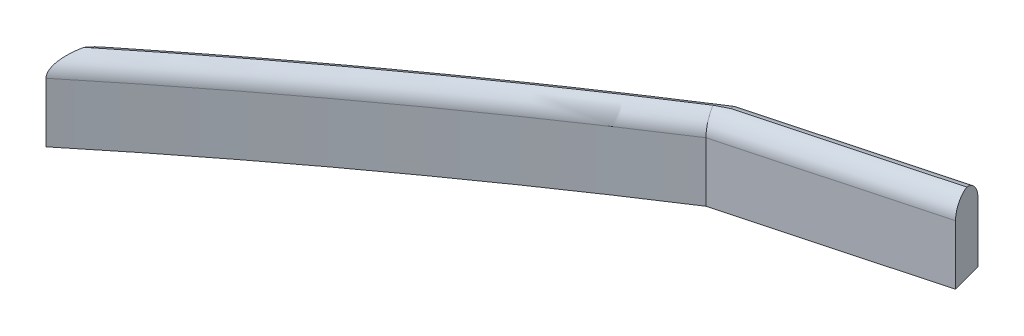
ISO-10303-21;
HEADER;
FILE_DESCRIPTION(('STEP AP214'),'2;1');
FILE_NAME('part.step','',(''),(''),'','','');
FILE_SCHEMA(('AUTOMOTIVE_DESIGN { 1 0 10303 214 1 1 1 1 }'));
ENDSEC;
DATA;
#1=APPLICATION_CONTEXT('core data for automotive mechanical design processes');
#2=APPLICATION_PROTOCOL_DEFINITION('international standard','automotive_design',2000,#1);
#3=PRODUCT_CONTEXT('',#1,'mechanical');
#4=PRODUCT('Part','Part','',(#3));
#5=PRODUCT_RELATED_PRODUCT_CATEGORY('part','',(#4));
#6=PRODUCT_DEFINITION_FORMATION('','',#4);
#7=PRODUCT_DEFINITION_CONTEXT('part definition',#1,'design');
#8=PRODUCT_DEFINITION('design','',#6,#7);
#9=PRODUCT_DEFINITION_SHAPE('','',#8);
#10=(LENGTH_UNIT() NAMED_UNIT(*) SI_UNIT(.MILLI.,.METRE.));
#11=(NAMED_UNIT(*) PLANE_ANGLE_UNIT() SI_UNIT($,.RADIAN.));
#12=(NAMED_UNIT(*) SI_UNIT($,.STERADIAN.) SOLID_ANGLE_UNIT());
#13=UNCERTAINTY_MEASURE_WITH_UNIT(LENGTH_MEASURE(1.E-05),#10,'distance_accuracy_value','');
#14=(GEOMETRIC_REPRESENTATION_CONTEXT(3) GLOBAL_UNCERTAINTY_ASSIGNED_CONTEXT((#13)) GLOBAL_UNIT_ASSIGNED_CONTEXT((#10,
#11,#12)) REPRESENTATION_CONTEXT('',''));
#15=CARTESIAN_POINT('',(0.,0.,0.));
#16=DIRECTION('',(0.,0.,1.));
#17=DIRECTION('',(1.,0.,0.));
#18=AXIS2_PLACEMENT_3D('',#15,#16,#17);
#19=CARTESIAN_POINT('',(-1.4296369539497,4.,-5.31676859567869));
#20=DIRECTION('',(-0.259668492412526,0.,-0.965697817149964));
#21=DIRECTION('',(-0.965697817149964,0.,0.259668492412526));
#22=AXIS2_PLACEMENT_3D('',#19,#20,#21);
#23=PLANE('',#22);
#24=DIRECTION('',(0.,-1.,0.));
#25=VECTOR('',#24,1.);
#26=CARTESIAN_POINT('',(13.350341006576,4.,-9.29098757675367));
#27=LINE('',#26,#25);
#28=CARTESIAN_POINT('',(13.350341006576,3.,-9.29098757675367));
#29=VERTEX_POINT('',#28);
#30=CARTESIAN_POINT('',(13.350341006576,0.,-9.29098757675367));
#31=VERTEX_POINT('',#30);
#32=EDGE_CURVE('E84',#29,#31,#27,.T.);
#33=ORIENTED_EDGE('',*,*,#32,.F.);
#34=DIRECTION('',(0.965697817149964,0.,-0.259668492412526));
#35=VECTOR('',#34,1.);
#36=CARTESIAN_POINT('',(-1.4296369539497,3.,-5.31676859567869));
#37=LINE('',#36,#35);
#38=CARTESIAN_POINT('',(22.8710214235548,3.,-11.85102311449));
#39=VERTEX_POINT('',#38);
#40=EDGE_CURVE('E127',#29,#39,#37,.T.);
#41=ORIENTED_EDGE('',*,*,#40,.T.);
#42=DIRECTION('',(0.,-1.,0.));
#43=VECTOR('',#42,1.);
#44=CARTESIAN_POINT('',(22.8710214235548,4.,-11.85102311449));
#45=LINE('',#44,#43);
#46=CARTESIAN_POINT('',(22.8710214235548,0.,-11.85102311449));
#47=VERTEX_POINT('',#46);
#48=EDGE_CURVE('E210',#39,#47,#45,.T.);
#49=ORIENTED_EDGE('',*,*,#48,.T.);
#50=DIRECTION('',(0.965697817149964,0.,-0.259668492412526));
#51=VECTOR('',#50,1.);
#52=CARTESIAN_POINT('',(-1.4296369539497,0.,-5.31676859567869));
#53=LINE('',#52,#51);
#54=EDGE_CURVE('E222',#31,#47,#53,.T.);
#55=ORIENTED_EDGE('',*,*,#54,.F.);
#56=EDGE_LOOP('',(#33,#41,#49,#55));
#57=FACE_BOUND('',#56,.T.);
#58=ADVANCED_FACE('F41',(#57),#23,.T.);
#59=CARTESIAN_POINT('',(127.771889532109,4.,169.359958318483));
#60=DIRECTION('',(0.,-1.,0.));
#61=DIRECTION('',(0.,0.,-1.));
#62=AXIS2_PLACEMENT_3D('',#59,#60,#61);
#63=CYLINDRICAL_SURFACE('',#62,212.151953175651);
#64=DIRECTION('',(0.,-1.,0.));
#65=VECTOR('',#64,1.);
#66=CARTESIAN_POINT('',(-4.82016025459314,4.,3.74655436335475));
#67=LINE('',#66,#65);
#68=CARTESIAN_POINT('',(-4.82016025459314,3.,3.74655436335475));
#69=VERTEX_POINT('',#68);
#70=CARTESIAN_POINT('',(-4.82016025459314,0.,3.74655436335475));
#71=VERTEX_POINT('',#70);
#72=EDGE_CURVE('E133',#69,#71,#67,.T.);
#73=ORIENTED_EDGE('',*,*,#72,.F.);
#74=CARTESIAN_POINT('',(127.771889532109,3.,169.359958318483));
#75=DIRECTION('',(0.,1.,0.));
#76=DIRECTION('',(0.,0.,1.));
#77=AXIS2_PLACEMENT_3D('',#74,#75,#76);
#78=CIRCLE('',#77,212.151953175651);
#79=EDGE_CURVE('E11',#69,#29,#78,.F.);
#80=ORIENTED_EDGE('',*,*,#79,.T.);
#81=ORIENTED_EDGE('',*,*,#32,.T.);
#82=CARTESIAN_POINT('',(127.771889532109,0.,169.359958318483));
#83=DIRECTION('',(0.,1.,0.));
#84=DIRECTION('',(0.,0.,1.));
#85=AXIS2_PLACEMENT_3D('',#82,#83,#84);
#86=CIRCLE('',#85,212.151953175651);
#87=EDGE_CURVE('E192',#31,#71,#86,.T.);
#88=ORIENTED_EDGE('',*,*,#87,.T.);
#89=EDGE_LOOP('',(#73,#80,#81,#88));
#90=FACE_BOUND('',#89,.T.);
#91=ADVANCED_FACE('F184',(#90),#63,.T.);
#92=CARTESIAN_POINT('',(-2.81187917765675,4.,-1.15264600679133));
#93=DIRECTION('',(-0.925277827563089,0.,-0.379290049724655));
#94=DIRECTION('',(-0.379290049724655,0.,0.925277827563089));
#95=AXIS2_PLACEMENT_3D('',#92,#93,#94);
#96=PLANE('',#95);
#97=DIRECTION('',(0.,-1.,0.));
#98=VECTOR('',#97,1.);
#99=CARTESIAN_POINT('',(-5.92806895412716,4.,6.44929690929623));
#100=LINE('',#99,#98);
#101=CARTESIAN_POINT('',(-5.92806895412716,3.,6.44929690929623));
#102=VERTEX_POINT('',#101);
#103=CARTESIAN_POINT('',(-5.92806895412716,0.,6.44929690929623));
#104=VERTEX_POINT('',#103);
#105=EDGE_CURVE('E121',#102,#104,#100,.T.);
#106=ORIENTED_EDGE('',*,*,#105,.F.);
#107=CARTESIAN_POINT('',(-5.92806895412707,3.,6.44929690929634));
#108=CARTESIAN_POINT('',(-5.92809716579559,3.02899945754281,6.44936573164299));
#109=CARTESIAN_POINT('',(-5.92706230414477,3.05790291660423,6.44684118732441));
#110=CARTESIAN_POINT('',(-5.92312672924477,3.1144987618452,6.43724035493674));
#111=CARTESIAN_POINT('',(-5.92024663940333,3.14220096452951,6.43021437765736));
#112=CARTESIAN_POINT('',(-5.91199159838725,3.20246188056569,6.41007621051235));
#113=CARTESIAN_POINT('',(-5.90618552708595,3.23460369165767,6.39591230338046));
#114=CARTESIAN_POINT('',(-5.89267654183276,3.2960853343428,6.36295714271455));
#115=CARTESIAN_POINT('',(-5.88496504082401,3.32541162285829,6.34414494106095));
#116=CARTESIAN_POINT('',(-5.86337083256309,3.39705779459704,6.29146588417003));
#117=CARTESIAN_POINT('',(-5.84847803765235,3.43724007259731,6.25513492075204));
#118=CARTESIAN_POINT('',(-5.81663463457315,3.5113554732729,6.17745295982339));
#119=CARTESIAN_POINT('',(-5.79968003428045,3.54527614189422,6.13609222352826));
#120=CARTESIAN_POINT('',(-5.76542979328686,3.60618066333855,6.05253878308585));
#121=CARTESIAN_POINT('',(-5.7482044188758,3.63344375213111,6.01051749350656));
#122=CARTESIAN_POINT('',(-5.71293618098463,3.68405212816676,5.92448065030012));
#123=CARTESIAN_POINT('',(-5.6948926040173,3.7073939091583,5.88046335612139));
#124=CARTESIAN_POINT('',(-5.65814644543494,3.75078544429752,5.79082112635803));
#125=CARTESIAN_POINT('',(-5.63944112272148,3.77081890521704,5.74518950386557));
#126=CARTESIAN_POINT('',(-5.60160375579942,3.80787461838802,5.65288527207313));
#127=CARTESIAN_POINT('',(-5.58247156635815,3.82489582763236,5.60621230847814));
#128=CARTESIAN_POINT('',(-5.52822346391773,3.86897455481798,5.47387409815089));
#129=CARTESIAN_POINT('',(-5.4927455839235,3.89295624675614,5.38732583317154));
#130=CARTESIAN_POINT('',(-5.4211515759688,3.93333004862564,5.21267229771772));
#131=CARTESIAN_POINT('',(-5.38503476726694,3.94971348561067,5.12456536657511));
#132=CARTESIAN_POINT('',(-5.31334084607263,3.97524582561528,4.9496680928388));
#133=CARTESIAN_POINT('',(-5.277772331654,3.9845628778426,4.86289872524056));
#134=CARTESIAN_POINT('',(-5.22435320822047,3.99384234550716,4.73258280865699));
#135=CARTESIAN_POINT('',(-5.20655636837845,3.99615284719928,4.68916742953362));
#136=CARTESIAN_POINT('',(-5.17094480785062,3.99923054595483,4.60229305098022));
#137=CARTESIAN_POINT('',(-5.15313008860525,3.99999785869761,4.5588340550641));
#138=CARTESIAN_POINT('',(-5.13531396659629,4.,4.51537163710715));
#139=B_SPLINE_CURVE_WITH_KNOTS('',3,(#107,#108,#109,#110,#111,#112,#113,#114,#115,#116,#117,
#118,#119,#120,#121,#122,#123,#124,#125,#126,#127,#128,#129,#130,#131,#132,#133,#134,#135,#136,
#137,#138),.UNSPECIFIED.,.F.,.F.,(4,2,2,2,2,2,2,2,2,2,2,2,2,2,2,4),(0.,0.0867150780349251,
0.172477492175808,0.278688252277466,0.385386685230202,0.552985841834986,0.720914835918608,
0.87959089474906,1.03840808778212,1.19798551207075,1.35761808318556,1.64689475289305,
1.93650080656908,2.2189783041187,2.35989191975161,2.50079497193032),.UNSPECIFIED.);
#140=CARTESIAN_POINT('',(-5.37104694113991,3.95424577492995,5.0904420739115));
#141=VERTEX_POINT('',#140);
#142=EDGE_CURVE('E52',#102,#141,#139,.T.);
#143=ORIENTED_EDGE('',*,*,#142,.T.);
#144=CARTESIAN_POINT('',(-5.6078961446883,4.,5.66823555064097));
#145=CARTESIAN_POINT('',(-5.58711246686556,3.99999611395211,5.61753378222243));
#146=CARTESIAN_POINT('',(-5.5663302621837,3.99897254997292,5.5668356075301));
#147=CARTESIAN_POINT('',(-5.52479181596345,3.9948461518032,5.46550259521692));
#148=CARTESIAN_POINT('',(-5.50403557994838,3.99174293243523,5.4148677710702));
#149=CARTESIAN_POINT('',(-5.44162496278576,3.97920887466118,5.26261711143115));
#150=CARTESIAN_POINT('',(-5.40005687796771,3.96655268177009,5.16121179577808));
#151=CARTESIAN_POINT('',(-5.31705502323599,3.93174172427004,4.95872882559305));
#152=CARTESIAN_POINT('',(-5.27562663175522,3.90949440962198,4.85766429174464));
#153=CARTESIAN_POINT('',(-5.21434419819725,3.86787919043,4.70816583526929));
#154=CARTESIAN_POINT('',(-5.19408126030891,3.85265405130243,4.65873441157922));
#155=CARTESIAN_POINT('',(-5.15392378125981,3.81915503654631,4.5607702677744));
#156=CARTESIAN_POINT('',(-5.13402913080737,3.80088208202814,4.51223728104269));
#157=CARTESIAN_POINT('',(-5.09326479659602,3.75940554777733,4.41279271446753));
#158=CARTESIAN_POINT('',(-5.07243371105388,3.73593515486883,4.36197529494861));
#159=CARTESIAN_POINT('',(-5.03159264651004,3.68437046994959,4.26234354477766));
#160=CARTESIAN_POINT('',(-5.01158282981133,3.65627526940739,4.2135296100637));
#161=CARTESIAN_POINT('',(-4.97263739180054,3.59432972619622,4.118522239577));
#162=CARTESIAN_POINT('',(-4.95371232435814,3.56043257868085,4.07235454996241));
#163=CARTESIAN_POINT('',(-4.91787205020168,3.48589854982672,3.98492222466194));
#164=CARTESIAN_POINT('',(-4.90095135679391,3.44528083263623,3.94364420419036));
#165=CARTESIAN_POINT('',(-4.87694660633733,3.37513247061037,3.88508463119395));
#166=CARTESIAN_POINT('',(-4.86874698388639,3.34827110679535,3.86508165760224));
#167=CARTESIAN_POINT('',(-4.85381853130618,3.29177287607716,3.82866370732297));
#168=CARTESIAN_POINT('',(-4.84709016915666,3.26213513032949,3.8122498722717));
#169=CARTESIAN_POINT('',(-4.83551492984212,3.19984027132433,3.78401208355498));
#170=CARTESIAN_POINT('',(-4.83069530244911,3.16714713082261,3.77225460569047));
#171=CARTESIAN_POINT('',(-4.82362787784757,3.09993513224536,3.75501362800985));
#172=CARTESIAN_POINT('',(-4.82136952580864,3.06542438475816,3.74950437969193));
#173=CARTESIAN_POINT('',(-4.82028164679566,3.02049847519439,3.7468504995532));
#174=CARTESIAN_POINT('',(-4.82015727361924,3.01024681837726,3.74654709127088));
#175=CARTESIAN_POINT('',(-4.82016025459324,2.99999999999999,3.746554363355));
#176=B_SPLINE_CURVE_WITH_KNOTS('',3,(#144,#145,#146,#147,#148,#149,#150,#151,#152,#153,#154,
#155,#156,#157,#158,#159,#160,#161,#162,#163,#164,#165,#166,#167,#168,#169,#170,#171,#172,#173,
#174,#175),.UNSPECIFIED.,.F.,.F.,(4,2,2,2,2,2,2,2,2,2,2,2,2,2,2,4),(0.,0.164370782835836,
0.328772017554944,0.659374601256373,0.993241378589786,1.15981937531923,1.32634711978404,
1.50534937203079,1.68438683086293,1.86494325923908,2.04499342247238,2.14817992071673,
2.25139919302061,2.35604308751101,2.46025416709694,2.49100412049127),.UNSPECIFIED.);
#177=EDGE_CURVE('E126',#141,#69,#176,.T.);
#178=ORIENTED_EDGE('',*,*,#177,.T.);
#179=ORIENTED_EDGE('',*,*,#72,.T.);
#180=DIRECTION('',(0.379290049724655,0.,-0.925277827563089));
#181=VECTOR('',#180,1.);
#182=CARTESIAN_POINT('',(-2.81187917765675,0.,-1.15264600679133));
#183=LINE('',#182,#181);
#184=EDGE_CURVE('E131',#104,#71,#183,.T.);
#185=ORIENTED_EDGE('',*,*,#184,.F.);
#186=EDGE_LOOP('',(#106,#143,#178,#179,#185));
#187=FACE_BOUND('',#186,.T.);
#188=ADVANCED_FACE('F129',(#187),#96,.T.);
#189=CARTESIAN_POINT('',(127.771889532109,4.,169.359958318483));
#190=DIRECTION('',(0.,-1.,0.));
#191=DIRECTION('',(0.,0.,-1.));
#192=AXIS2_PLACEMENT_3D('',#189,#190,#191);
#193=CYLINDRICAL_SURFACE('',#192,210.75);
#194=DIRECTION('',(0.,-1.,0.));
#195=VECTOR('',#194,1.);
#196=CARTESIAN_POINT('',(13.350341006576,4.,-7.62385939663734));
#197=LINE('',#196,#195);
#198=CARTESIAN_POINT('',(13.350341006576,3.,-7.62385939663734));
#199=VERTEX_POINT('',#198);
#200=CARTESIAN_POINT('',(13.350341006576,0.,-7.62385939663734));
#201=VERTEX_POINT('',#200);
#202=EDGE_CURVE('E123',#199,#201,#197,.T.);
#203=ORIENTED_EDGE('',*,*,#202,.F.);
#204=CARTESIAN_POINT('',(127.771889532109,3.,169.359958318483));
#205=DIRECTION('',(0.,1.,0.));
#206=DIRECTION('',(0.,0.,1.));
#207=AXIS2_PLACEMENT_3D('',#204,#205,#206);
#208=CIRCLE('',#207,210.75);
#209=EDGE_CURVE('E118',#199,#102,#208,.T.);
#210=ORIENTED_EDGE('',*,*,#209,.T.);
#211=ORIENTED_EDGE('',*,*,#105,.T.);
#212=CARTESIAN_POINT('',(127.771889532109,0.,169.359958318483));
#213=DIRECTION('',(0.,1.,0.));
#214=DIRECTION('',(0.,0.,1.));
#215=AXIS2_PLACEMENT_3D('',#212,#213,#214);
#216=CIRCLE('',#215,210.75);
#217=EDGE_CURVE('E218',#201,#104,#216,.T.);
#218=ORIENTED_EDGE('',*,*,#217,.F.);
#219=EDGE_LOOP('',(#203,#210,#211,#218));
#220=FACE_BOUND('',#219,.T.);
#221=ADVANCED_FACE('F119',(#220),#193,.F.);
#222=CARTESIAN_POINT('',(-1.01158573039647,4.,-3.76205107761778));
#223=DIRECTION('',(0.259668492412525,0.,0.965697817149965));
#224=DIRECTION('',(0.965697817149965,0.,-0.259668492412525));
#225=AXIS2_PLACEMENT_3D('',#222,#223,#224);
#226=PLANE('',#225);
#227=DIRECTION('',(0.,-1.,0.));
#228=VECTOR('',#227,1.);
#229=CARTESIAN_POINT('',(23.2890726471078,4.,-10.296305596429));
#230=LINE('',#229,#228);
#231=CARTESIAN_POINT('',(23.2890726471078,3.,-10.296305596429));
#232=VERTEX_POINT('',#231);
#233=CARTESIAN_POINT('',(23.2890726471078,0.,-10.296305596429));
#234=VERTEX_POINT('',#233);
#235=EDGE_CURVE('E208',#232,#234,#230,.T.);
#236=ORIENTED_EDGE('',*,*,#235,.F.);
#237=DIRECTION('',(-0.965697817149965,0.,0.259668492412525));
#238=VECTOR('',#237,1.);
#239=CARTESIAN_POINT('',(-1.01158573039647,3.,-3.76205107761778));
#240=LINE('',#239,#238);
#241=EDGE_CURVE('E204',#232,#199,#240,.T.);
#242=ORIENTED_EDGE('',*,*,#241,.T.);
#243=ORIENTED_EDGE('',*,*,#202,.T.);
#244=DIRECTION('',(-0.965697817149965,0.,0.259668492412525));
#245=VECTOR('',#244,1.);
#246=CARTESIAN_POINT('',(-1.01158573039647,0.,-3.76205107761778));
#247=LINE('',#246,#245);
#248=EDGE_CURVE('E215',#234,#201,#247,.T.);
#249=ORIENTED_EDGE('',*,*,#248,.F.);
#250=EDGE_LOOP('',(#236,#242,#243,#249));
#251=FACE_BOUND('',#250,.T.);
#252=ADVANCED_FACE('F234',(#251),#226,.T.);
#253=CARTESIAN_POINT('',(24.3006583775046,4.,-6.53425451880868));
#254=DIRECTION('',(0.965697817149991,0.,-0.259668492412426));
#255=DIRECTION('',(-0.259668492412426,0.,-0.965697817149991));
#256=AXIS2_PLACEMENT_3D('',#253,#254,#255);
#257=PLANE('',#256);
#258=CARTESIAN_POINT('',(23.1306899159672,3.,-10.88532529734));
#259=DIRECTION('',(0.965697817149991,0.,-0.259668492412426));
#260=DIRECTION('',(-0.259668492412426,0.,-0.965697817149991));
#261=AXIS2_PLACEMENT_3D('',#258,#259,#260);
#262=CIRCLE('',#261,1.);
#263=CARTESIAN_POINT('',(23.0800470353313,3.98079748053692,-11.0736643554595));
#264=VERTEX_POINT('',#263);
#265=EDGE_CURVE('E197',#39,#264,#262,.T.);
#266=ORIENTED_EDGE('',*,*,#265,.T.);
#267=CARTESIAN_POINT('',(23.0294041546954,3.,-11.262003413579));
#268=DIRECTION('',(0.965697817149991,0.,-0.259668492412426));
#269=DIRECTION('',(-0.259668492412426,0.,-0.965697817149991));
#270=AXIS2_PLACEMENT_3D('',#267,#268,#269);
#271=CIRCLE('',#270,1.);
#272=EDGE_CURVE('E199',#264,#232,#271,.T.);
#273=ORIENTED_EDGE('',*,*,#272,.T.);
#274=ORIENTED_EDGE('',*,*,#235,.T.);
#275=DIRECTION('',(0.259668492412426,0.,0.965697817149991));
#276=VECTOR('',#275,1.);
#277=CARTESIAN_POINT('',(24.3006583775046,0.,-6.53425451880868));
#278=LINE('',#277,#276);
#279=EDGE_CURVE('E212',#47,#234,#278,.T.);
#280=ORIENTED_EDGE('',*,*,#279,.F.);
#281=ORIENTED_EDGE('',*,*,#48,.F.);
#282=EDGE_LOOP('',(#266,#273,#274,#280,#281));
#283=FACE_BOUND('',#282,.T.);
#284=ADVANCED_FACE('F228',(#283),#257,.T.);
#285=CARTESIAN_POINT('',(0.,0.,0.));
#286=DIRECTION('',(0.,1.,0.));
#287=DIRECTION('',(0.,0.,1.));
#288=AXIS2_PLACEMENT_3D('',#285,#286,#287);
#289=PLANE('',#288);
#290=ORIENTED_EDGE('',*,*,#54,.T.);
#291=ORIENTED_EDGE('',*,*,#279,.T.);
#292=ORIENTED_EDGE('',*,*,#248,.T.);
#293=ORIENTED_EDGE('',*,*,#217,.T.);
#294=ORIENTED_EDGE('',*,*,#184,.T.);
#295=ORIENTED_EDGE('',*,*,#87,.F.);
#296=EDGE_LOOP('',(#290,#291,#292,#293,#294,#295));
#297=FACE_BOUND('',#296,.T.);
#298=ADVANCED_FACE('F156',(#297),#289,.F.);
#299=CARTESIAN_POINT('',(127.771889532109,3.,169.359958318483));
#300=DIRECTION('',(0.,1.,0.));
#301=DIRECTION('',(0.,0.,1.));
#302=AXIS2_PLACEMENT_3D('',#299,#300,#301);
#303=TOROIDAL_SURFACE('',#302,211.75,1.);
#304=CARTESIAN_POINT('',(127.771889532109,3.95424577492996,169.359958318483));
#305=DIRECTION('',(0.,1.,0.));
#306=DIRECTION('',(0.,0.,1.));
#307=AXIS2_PLACEMENT_3D('',#304,#305,#306);
#308=CIRCLE('',#307,211.450976587826);
#309=CARTESIAN_POINT('',(13.0622077142722,3.95424577492996,-8.27225834616313));
#310=VERTEX_POINT('',#309);
#311=EDGE_CURVE('E46',#141,#310,#308,.F.);
#312=ORIENTED_EDGE('',*,*,#311,.F.);
#313=ORIENTED_EDGE('',*,*,#142,.F.);
#314=ORIENTED_EDGE('',*,*,#209,.F.);
#315=CARTESIAN_POINT('',(13.350341006576,3.,-7.62385939663734));
#316=CARTESIAN_POINT('',(13.3503410061688,3.02788720485854,-7.62385940371254));
#317=CARTESIAN_POINT('',(13.3498610459976,3.05576096188797,-7.62493909331011));
#318=CARTESIAN_POINT('',(13.34794680024,3.11130712265653,-7.62924530556041));
#319=CARTESIAN_POINT('',(13.3465125834397,3.13897954076354,-7.63247167347309));
#320=CARTESIAN_POINT('',(13.3407941740623,3.22133347052012,-7.6453357213854));
#321=CARTESIAN_POINT('',(13.3350941727345,3.2754602269967,-7.65815845715114));
#322=CARTESIAN_POINT('',(13.320088619339,3.38058279022236,-7.69191613934264));
#323=CARTESIAN_POINT('',(13.3107817794792,3.43157747114749,-7.71285398320108));
#324=CARTESIAN_POINT('',(13.2888424526911,3.52902338307332,-7.76221377079681));
#325=CARTESIAN_POINT('',(13.2762104126245,3.57547522342066,-7.79063470890778));
#326=CARTESIAN_POINT('',(13.247917175176,3.66279611373967,-7.85429557356469));
#327=CARTESIAN_POINT('',(13.2322403868451,3.70363449818149,-7.88957059758817));
#328=CARTESIAN_POINT('',(13.1983496380262,3.77835283966236,-7.96583476761619));
#329=CARTESIAN_POINT('',(13.1801348255633,3.81223045059003,-8.00682583240923));
#330=CARTESIAN_POINT('',(13.1414661058446,3.87246913180565,-8.09385335850964));
#331=CARTESIAN_POINT('',(13.1209885882334,3.89873804989355,-8.13994302865169));
#332=CARTESIAN_POINT('',(13.0785554638185,3.94252249947941,-8.23545690130234));
#333=CARTESIAN_POINT('',(13.0566008218335,3.96004368297566,-8.28487892724874));
#334=CARTESIAN_POINT('',(13.0194324776035,3.98151883760445,-8.36855546797735));
#335=CARTESIAN_POINT('',(13.0044541357077,3.98805801941772,-8.40227779391631));
#336=CARTESIAN_POINT('',(12.9743140250581,3.99705447235784,-8.47013917812515));
#337=CARTESIAN_POINT('',(12.9591526019631,3.99951849962494,-8.50427745193008));
#338=CARTESIAN_POINT('',(12.9424462129557,3.99997875133098,-8.54189653747536));
#339=CARTESIAN_POINT('',(12.9408981908055,4.0000000558988,-8.54538236000362));
#340=CARTESIAN_POINT('',(12.9393503148056,4.,-8.54886787321102));
#341=B_SPLINE_CURVE_WITH_KNOTS('',3,(#315,#316,#317,#318,#319,#320,#321,#322,#323,#324,#325,
#326,#327,#328,#329,#330,#331,#332,#333,#334,#335,#336,#337,#338,#339,#340),.UNSPECIFIED.,.F.,
.F.,(4,2,2,2,2,2,2,2,2,2,2,2,4),(0.,0.0836099292214484,0.16721383220083,0.334100099190797,
0.501046006523649,0.66796949003303,0.835771399098402,1.00362977293777,1.17344342496221,
1.3431472162479,1.45537377718134,1.56741409211205,1.57885627901826),.UNSPECIFIED.);
#342=EDGE_CURVE('E161',#310,#199,#341,.F.);
#343=ORIENTED_EDGE('',*,*,#342,.F.);
#344=EDGE_LOOP('',(#312,#313,#314,#343));
#345=FACE_BOUND('',#344,.T.);
#346=ADVANCED_FACE('F135',(#345),#303,.T.);
#347=CARTESIAN_POINT('',(127.771889532109,3.,169.359958318483));
#348=DIRECTION('',(0.,1.,0.));
#349=DIRECTION('',(0.,0.,1.));
#350=AXIS2_PLACEMENT_3D('',#347,#348,#349);
#351=TOROIDAL_SURFACE('',#350,211.151953175651,1.);
#352=CARTESIAN_POINT('',(13.350341006576,3.,-9.29098757675367));
#353=CARTESIAN_POINT('',(13.35034101383,3.02789355786755,-9.29098756640593));
#354=CARTESIAN_POINT('',(13.3508187210385,3.05577366763443,-9.28990672569273));
#355=CARTESIAN_POINT('',(13.3527240261292,3.1113325477524,-9.28559589990562));
#356=CARTESIAN_POINT('',(13.3541515562678,3.13901133232016,-9.28236606810284));
#357=CARTESIAN_POINT('',(13.3598434532522,3.22138487159406,-9.26948806918682));
#358=CARTESIAN_POINT('',(13.3655171754921,3.27552483559615,-9.25665128772657));
#359=CARTESIAN_POINT('',(13.3804548471937,3.38067341147363,-9.222855984185));
#360=CARTESIAN_POINT('',(13.3897200923481,3.431680885557,-9.20189453101367));
#361=CARTESIAN_POINT('',(13.4115637233004,3.52915045945753,-9.15247833280819));
#362=CARTESIAN_POINT('',(13.4241416534761,3.57561318314919,-9.12402461824952));
#363=CARTESIAN_POINT('',(13.45231498575,3.66294552721069,-9.06029469886041));
#364=CARTESIAN_POINT('',(13.4679254640199,3.70378538440226,-9.02498440726725));
#365=CARTESIAN_POINT('',(13.5016770936674,3.77850344148165,-8.94864460437861));
#366=CARTESIAN_POINT('',(13.5198190940102,3.81237929647356,-8.90761317445958));
#367=CARTESIAN_POINT('',(13.5583325186951,3.87260056573437,-8.82051448795489));
#368=CARTESIAN_POINT('',(13.5787269054937,3.89885616565657,-8.77439537046235));
#369=CARTESIAN_POINT('',(13.6209930188677,3.94261315853476,-8.67882400166687));
#370=CARTESIAN_POINT('',(13.6428637743096,3.96012024365587,-8.62937394145399));
#371=CARTESIAN_POINT('',(13.679873232209,3.98155887701258,-8.54570203009238));
#372=CARTESIAN_POINT('',(13.6947753932576,3.98808170732888,-8.51201264138986));
#373=CARTESIAN_POINT('',(13.7247646272091,3.99705720485174,-8.44421956772493));
#374=CARTESIAN_POINT('',(13.739851352806,3.99951659825482,-8.4101166617306));
#375=CARTESIAN_POINT('',(13.7564863869284,3.99997855529757,-8.37251594117548));
#376=CARTESIAN_POINT('',(13.758036288502,4.00000005640602,-8.36901266696403));
#377=CARTESIAN_POINT('',(13.759586057944,4.,-8.36550971130542));
#378=B_SPLINE_CURVE_WITH_KNOTS('',3,(#352,#353,#354,#355,#356,#357,#358,#359,#360,#361,#362,
#363,#364,#365,#366,#367,#368,#369,#370,#371,#372,#373,#374,#375,#376,#377),.UNSPECIFIED.,.F.,
.F.,(4,2,2,2,2,2,2,2,2,2,2,2,4),(0.,0.0836289859233996,0.167252007868927,0.334178128101058,
0.501164525422926,0.668127967647401,0.835943745025555,1.00381593655926,1.17359307033753,
1.34325959541272,1.45529833318353,1.56715142703695,1.57864376109806),.UNSPECIFIED.);
#379=CARTESIAN_POINT('',(13.6797429904032,3.98079748053692,-8.54599707050097));
#380=VERTEX_POINT('',#379);
#381=EDGE_CURVE('E71',#29,#380,#378,.T.);
#382=ORIENTED_EDGE('',*,*,#381,.F.);
#383=ORIENTED_EDGE('',*,*,#79,.F.);
#384=ORIENTED_EDGE('',*,*,#177,.F.);
#385=ORIENTED_EDGE('',*,*,#311,.T.);
#386=CARTESIAN_POINT('',(13.8160493834031,3.98505740104181,-8.60626136784381));
#387=CARTESIAN_POINT('',(13.7382059635705,3.98278276164695,-8.5718611554));
#388=CARTESIAN_POINT('',(13.660379255101,3.98023954362909,-8.53744055051207));
#389=CARTESIAN_POINT('',(13.5047669914051,3.97459520327826,-8.46856203201644));
#390=CARTESIAN_POINT('',(13.4269814344165,3.97149410717062,-8.43410412023815));
#391=CARTESIAN_POINT('',(13.271451743527,3.9647130474532,-8.36515116692856));
#392=CARTESIAN_POINT('',(13.1937076097026,3.96103308277806,-8.33065612532905));
#393=CARTESIAN_POINT('',(13.0382622171636,3.95306721856257,-8.26162962417222));
#394=CARTESIAN_POINT('',(12.9605609606362,3.94878129054907,-8.22709816297935));
#395=CARTESIAN_POINT('',(12.8828854517566,3.94417901620689,-8.19255043779047));
#396=B_SPLINE_CURVE_WITH_KNOTS('',3,(#386,#387,#388,#389,#390,#391,#392,#393,#394,#395),
.UNSPECIFIED.,.F.,.F.,(4,2,2,2,4),(0.,0.255407907866041,0.510803812374677,0.766200186923791,
1.02160856609239),.UNSPECIFIED.);
#397=EDGE_CURVE('E167',#380,#310,#396,.T.);
#398=ORIENTED_EDGE('',*,*,#397,.F.);
#399=EDGE_LOOP('',(#382,#383,#384,#385,#398));
#400=FACE_BOUND('',#399,.T.);
#401=ADVANCED_FACE('F155',(#400),#351,.T.);
#402=CARTESIAN_POINT('',(-1.16996846153717,3.,-4.35107077852872));
#403=DIRECTION('',(0.965697817149964,0.,-0.259668492412526));
#404=DIRECTION('',(-0.259668492412526,0.,-0.965697817149964));
#405=AXIS2_PLACEMENT_3D('',#402,#403,#404);
#406=CYLINDRICAL_SURFACE('',#405,1.);
#407=ORIENTED_EDGE('',*,*,#40,.F.);
#408=ORIENTED_EDGE('',*,*,#381,.T.);
#409=DIRECTION('',(0.965697817149964,0.,-0.259668492412526));
#410=VECTOR('',#409,1.);
#411=CARTESIAN_POINT('',(18.2911447855911,3.98079748053692,-9.78596647997817));
#412=LINE('',#411,#410);
#413=EDGE_CURVE('E236',#264,#380,#412,.F.);
#414=ORIENTED_EDGE('',*,*,#413,.F.);
#415=ORIENTED_EDGE('',*,*,#265,.F.);
#416=EDGE_LOOP('',(#407,#408,#414,#415));
#417=FACE_BOUND('',#416,.T.);
#418=ADVANCED_FACE('F43',(#417),#406,.T.);
#419=CARTESIAN_POINT('',(-1.27125422280899,3.,-4.72774889476774));
#420=DIRECTION('',(-0.965697817149965,0.,0.259668492412525));
#421=DIRECTION('',(0.259668492412525,0.,0.965697817149965));
#422=AXIS2_PLACEMENT_3D('',#419,#420,#421);
#423=CYLINDRICAL_SURFACE('',#422,1.);
#424=ORIENTED_EDGE('',*,*,#397,.T.);
#425=ORIENTED_EDGE('',*,*,#342,.T.);
#426=ORIENTED_EDGE('',*,*,#241,.F.);
#427=ORIENTED_EDGE('',*,*,#272,.F.);
#428=ORIENTED_EDGE('',*,*,#413,.T.);
#429=EDGE_LOOP('',(#424,#425,#426,#427,#428));
#430=FACE_BOUND('',#429,.T.);
#431=ADVANCED_FACE('F157',(#430),#423,.T.);
#432=CLOSED_SHELL('',(#58,#91,#188,#221,#252,#284,#298,#346,#401,#418,#431));
#433=MANIFOLD_SOLID_BREP('B2',#432);
#434=ADVANCED_BREP_SHAPE_REPRESENTATION('',(#18,#433),#14);
#435=SHAPE_DEFINITION_REPRESENTATION(#9,#434);
ENDSEC;
END-ISO-10303-21;
